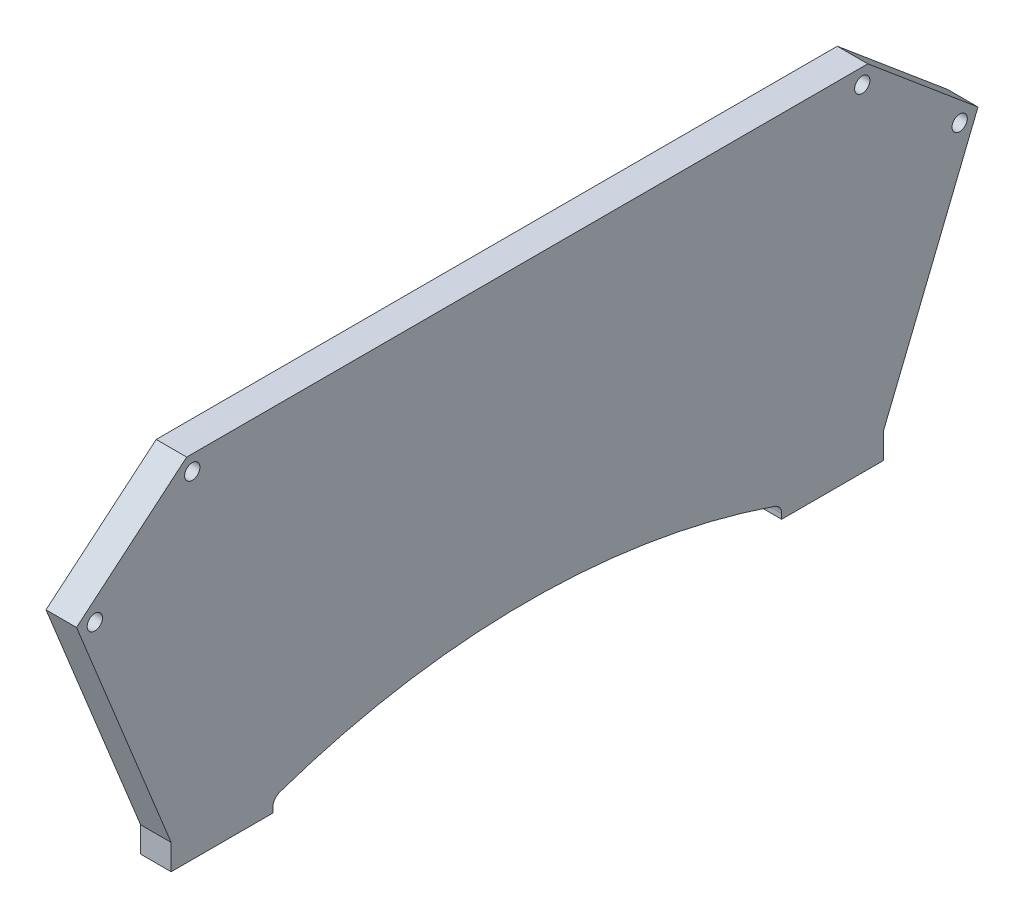
ISO-10303-21;
HEADER;
FILE_DESCRIPTION(('STEP AP214'),'2;1');
FILE_NAME('part.step','',(''),(''),'','','');
FILE_SCHEMA(('AUTOMOTIVE_DESIGN { 1 0 10303 214 1 1 1 1 }'));
ENDSEC;
DATA;
#1=APPLICATION_CONTEXT('core data for automotive mechanical design processes');
#2=APPLICATION_PROTOCOL_DEFINITION('international standard','automotive_design',2000,#1);
#3=PRODUCT_CONTEXT('',#1,'mechanical');
#4=PRODUCT('Part','Part','',(#3));
#5=PRODUCT_RELATED_PRODUCT_CATEGORY('part','',(#4));
#6=PRODUCT_DEFINITION_FORMATION('','',#4);
#7=PRODUCT_DEFINITION_CONTEXT('part definition',#1,'design');
#8=PRODUCT_DEFINITION('design','',#6,#7);
#9=PRODUCT_DEFINITION_SHAPE('','',#8);
#10=(LENGTH_UNIT() NAMED_UNIT(*) SI_UNIT(.MILLI.,.METRE.));
#11=(NAMED_UNIT(*) PLANE_ANGLE_UNIT() SI_UNIT($,.RADIAN.));
#12=(NAMED_UNIT(*) SI_UNIT($,.STERADIAN.) SOLID_ANGLE_UNIT());
#13=UNCERTAINTY_MEASURE_WITH_UNIT(LENGTH_MEASURE(1.E-05),#10,'distance_accuracy_value','');
#14=(GEOMETRIC_REPRESENTATION_CONTEXT(3) GLOBAL_UNCERTAINTY_ASSIGNED_CONTEXT((#13)) GLOBAL_UNIT_ASSIGNED_CONTEXT((#10,
#11,#12)) REPRESENTATION_CONTEXT('',''));
#15=CARTESIAN_POINT('',(0.,0.,0.));
#16=DIRECTION('',(0.,0.,1.));
#17=DIRECTION('',(1.,0.,0.));
#18=AXIS2_PLACEMENT_3D('',#15,#16,#17);
#19=CARTESIAN_POINT('',(6.,1.00000000000001,-22.));
#20=DIRECTION('',(-1.,0.,0.));
#21=DIRECTION('',(0.,0.,1.));
#22=AXIS2_PLACEMENT_3D('',#19,#20,#21);
#23=PLANE('',#22);
#24=CARTESIAN_POINT('',(6.,66.0696902421634,-4.15111107797449));
#25=DIRECTION('',(1.,0.,0.));
#26=DIRECTION('',(0.,0.,-1.));
#27=AXIS2_PLACEMENT_3D('',#24,#25,#26);
#28=CIRCLE('',#27,1.50000000000004);
#29=CARTESIAN_POINT('',(6.,66.0696902421634,-5.65111107797453));
#30=VERTEX_POINT('',#29);
#31=EDGE_CURVE('E349',#30,#30,#28,.T.);
#32=ORIENTED_EDGE('',*,*,#31,.F.);
#33=EDGE_LOOP('',(#32));
#34=FACE_BOUND('',#33,.T.);
#35=CARTESIAN_POINT('',(6.,50.,15.));
#36=DIRECTION('',(1.,0.,0.));
#37=DIRECTION('',(0.,0.,-1.));
#38=AXIS2_PLACEMENT_3D('',#35,#36,#37);
#39=CIRCLE('',#38,1.5);
#40=CARTESIAN_POINT('',(6.,50.,13.5));
#41=VERTEX_POINT('',#40);
#42=EDGE_CURVE('E173',#41,#41,#39,.T.);
#43=ORIENTED_EDGE('',*,*,#42,.F.);
#44=EDGE_LOOP('',(#43));
#45=FACE_BOUND('',#44,.T.);
#46=DIRECTION('',(0.,0.,-1.));
#47=VECTOR('',#46,1.);
#48=CARTESIAN_POINT('',(6.,0.,0.));
#49=LINE('',#48,#47);
#50=CARTESIAN_POINT('',(6.,0.,0.));
#51=VERTEX_POINT('',#50);
#52=CARTESIAN_POINT('',(6.,0.,-20.));
#53=VERTEX_POINT('',#52);
#54=EDGE_CURVE('E196',#51,#53,#49,.T.);
#55=ORIENTED_EDGE('',*,*,#54,.T.);
#56=DIRECTION('',(0.,1.,0.));
#57=VECTOR('',#56,1.);
#58=CARTESIAN_POINT('',(6.,1.,-20.));
#59=LINE('',#58,#57);
#60=CARTESIAN_POINT('',(6.,1.,-20.));
#61=VERTEX_POINT('',#60);
#62=EDGE_CURVE('E112',#53,#61,#59,.T.);
#63=ORIENTED_EDGE('',*,*,#62,.T.);
#64=CARTESIAN_POINT('',(6.,1.00000000000001,-22.));
#65=DIRECTION('',(-1.,0.,0.));
#66=DIRECTION('',(0.,0.,1.));
#67=AXIS2_PLACEMENT_3D('',#64,#65,#66);
#68=CIRCLE('',#67,2.);
#69=CARTESIAN_POINT('',(6.,2.8918918918919,-21.3513513513514));
#70=VERTEX_POINT('',#69);
#71=EDGE_CURVE('E229',#61,#70,#68,.T.);
#72=ORIENTED_EDGE('',*,*,#71,.T.);
#73=CARTESIAN_POINT('',(6.,-139.,-70.));
#74=DIRECTION('',(-1.,0.,0.));
#75=DIRECTION('',(0.,0.,-1.));
#76=AXIS2_PLACEMENT_3D('',#73,#74,#75);
#77=CIRCLE('',#76,150.);
#78=CARTESIAN_POINT('',(6.,2.8918918918919,-118.648648648649));
#79=VERTEX_POINT('',#78);
#80=EDGE_CURVE('E248',#70,#79,#77,.T.);
#81=ORIENTED_EDGE('',*,*,#80,.T.);
#82=CARTESIAN_POINT('',(6.,1.00000000000001,-118.));
#83=DIRECTION('',(-1.,0.,0.));
#84=DIRECTION('',(0.,0.,-1.));
#85=AXIS2_PLACEMENT_3D('',#82,#83,#84);
#86=CIRCLE('',#85,2.00000000000001);
#87=CARTESIAN_POINT('',(6.,1.,-120.));
#88=VERTEX_POINT('',#87);
#89=EDGE_CURVE('E245',#79,#88,#86,.T.);
#90=ORIENTED_EDGE('',*,*,#89,.T.);
#91=DIRECTION('',(0.,-1.,0.));
#92=VECTOR('',#91,1.);
#93=CARTESIAN_POINT('',(6.,1.,-120.));
#94=LINE('',#93,#92);
#95=CARTESIAN_POINT('',(6.,0.,-120.));
#96=VERTEX_POINT('',#95);
#97=EDGE_CURVE('E247',#88,#96,#94,.T.);
#98=ORIENTED_EDGE('',*,*,#97,.T.);
#99=DIRECTION('',(0.,0.,-1.));
#100=VECTOR('',#99,1.);
#101=CARTESIAN_POINT('',(6.,0.,-140.));
#102=LINE('',#101,#100);
#103=CARTESIAN_POINT('',(6.,0.,-140.));
#104=VERTEX_POINT('',#103);
#105=EDGE_CURVE('E250',#96,#104,#102,.T.);
#106=ORIENTED_EDGE('',*,*,#105,.T.);
#107=DIRECTION('',(0.,1.,0.));
#108=VECTOR('',#107,1.);
#109=CARTESIAN_POINT('',(6.,0.,-140.));
#110=LINE('',#109,#108);
#111=CARTESIAN_POINT('',(6.,5.,-140.));
#112=VERTEX_POINT('',#111);
#113=EDGE_CURVE('E256',#104,#112,#110,.T.);
#114=ORIENTED_EDGE('',*,*,#113,.T.);
#115=DIRECTION('',(0.,0.92678403028357,-0.37559467676119));
#116=VECTOR('',#115,1.);
#117=CARTESIAN_POINT('',(6.,50.8955248807109,-158.599926486736));
#118=LINE('',#117,#116);
#119=CARTESIAN_POINT('',(6.,50.8955248807109,-158.599926486736));
#120=VERTEX_POINT('',#119);
#121=EDGE_CURVE('E258',#112,#120,#118,.T.);
#122=ORIENTED_EDGE('',*,*,#121,.T.);
#123=DIRECTION('',(0.,0.642787609686541,0.766044443118977));
#124=VECTOR('',#123,1.);
#125=CARTESIAN_POINT('',(6.,69.0696902421635,-136.940799624824));
#126=LINE('',#125,#124);
#127=CARTESIAN_POINT('',(6.,69.0696902421635,-136.940799624824));
#128=VERTEX_POINT('',#127);
#129=EDGE_CURVE('E260',#120,#128,#126,.T.);
#130=ORIENTED_EDGE('',*,*,#129,.T.);
#131=DIRECTION('',(0.,0.,1.));
#132=VECTOR('',#131,1.);
#133=CARTESIAN_POINT('',(6.,69.0696902421636,-3.05920037517576));
#134=LINE('',#133,#132);
#135=CARTESIAN_POINT('',(6.,69.0696902421636,-3.05920037517576));
#136=VERTEX_POINT('',#135);
#137=EDGE_CURVE('E151',#128,#136,#134,.T.);
#138=ORIENTED_EDGE('',*,*,#137,.T.);
#139=DIRECTION('',(0.,-0.642787609686544,0.766044443118974));
#140=VECTOR('',#139,1.);
#141=CARTESIAN_POINT('',(6.,50.8955248807109,18.5999264867365));
#142=LINE('',#141,#140);
#143=CARTESIAN_POINT('',(6.,50.8955248807109,18.5999264867365));
#144=VERTEX_POINT('',#143);
#145=EDGE_CURVE('E145',#136,#144,#142,.T.);
#146=ORIENTED_EDGE('',*,*,#145,.T.);
#147=DIRECTION('',(0.,-0.92678403028357,-0.37559467676119));
#148=VECTOR('',#147,1.);
#149=CARTESIAN_POINT('',(6.,5.,0.));
#150=LINE('',#149,#148);
#151=CARTESIAN_POINT('',(6.,5.,0.));
#152=VERTEX_POINT('',#151);
#153=EDGE_CURVE('E149',#144,#152,#150,.T.);
#154=ORIENTED_EDGE('',*,*,#153,.T.);
#155=DIRECTION('',(0.,-1.,0.));
#156=VECTOR('',#155,1.);
#157=CARTESIAN_POINT('',(6.,0.,0.));
#158=LINE('',#157,#156);
#159=EDGE_CURVE('E50',#152,#51,#158,.T.);
#160=ORIENTED_EDGE('',*,*,#159,.T.);
#161=EDGE_LOOP('',(#55,#63,#72,#81,#90,#98,#106,#114,#122,#130,#138,#146,#154,#160));
#162=FACE_BOUND('',#161,.T.);
#163=CARTESIAN_POINT('',(6.,50.,-155.));
#164=DIRECTION('',(1.,0.,0.));
#165=DIRECTION('',(0.,0.,-1.));
#166=AXIS2_PLACEMENT_3D('',#163,#164,#165);
#167=CIRCLE('',#166,1.5);
#168=CARTESIAN_POINT('',(6.,50.,-156.5));
#169=VERTEX_POINT('',#168);
#170=EDGE_CURVE('E355',#169,#169,#167,.T.);
#171=ORIENTED_EDGE('',*,*,#170,.F.);
#172=EDGE_LOOP('',(#171));
#173=FACE_BOUND('',#172,.T.);
#174=CARTESIAN_POINT('',(6.,66.0696902421635,-135.848888922026));
#175=DIRECTION('',(1.,0.,0.));
#176=DIRECTION('',(0.,0.,-1.));
#177=AXIS2_PLACEMENT_3D('',#174,#175,#176);
#178=CIRCLE('',#177,1.5);
#179=CARTESIAN_POINT('',(6.,66.0696902421635,-137.348888922026));
#180=VERTEX_POINT('',#179);
#181=EDGE_CURVE('E343',#180,#180,#178,.T.);
#182=ORIENTED_EDGE('',*,*,#181,.F.);
#183=EDGE_LOOP('',(#182));
#184=FACE_BOUND('',#183,.T.);
#185=ADVANCED_FACE('F33',(#34,#45,#162,#173,#184),#23,.F.);
#186=CARTESIAN_POINT('',(0.,1.00000000000001,-22.));
#187=DIRECTION('',(-1.,0.,0.));
#188=DIRECTION('',(0.,0.,1.));
#189=AXIS2_PLACEMENT_3D('',#186,#187,#188);
#190=PLANE('',#189);
#191=CARTESIAN_POINT('',(0.,66.0696902421634,-4.15111107797449));
#192=DIRECTION('',(1.,0.,0.));
#193=DIRECTION('',(0.,0.,-1.));
#194=AXIS2_PLACEMENT_3D('',#191,#192,#193);
#195=CIRCLE('',#194,1.50000000000004);
#196=CARTESIAN_POINT('',(0.,66.0696902421634,-5.65111107797453));
#197=VERTEX_POINT('',#196);
#198=EDGE_CURVE('E346',#197,#197,#195,.T.);
#199=ORIENTED_EDGE('',*,*,#198,.T.);
#200=EDGE_LOOP('',(#199));
#201=FACE_BOUND('',#200,.T.);
#202=CARTESIAN_POINT('',(0.,50.,15.));
#203=DIRECTION('',(1.,0.,0.));
#204=DIRECTION('',(0.,0.,-1.));
#205=AXIS2_PLACEMENT_3D('',#202,#203,#204);
#206=CIRCLE('',#205,1.5);
#207=CARTESIAN_POINT('',(0.,50.,13.5));
#208=VERTEX_POINT('',#207);
#209=EDGE_CURVE('E358',#208,#208,#206,.T.);
#210=ORIENTED_EDGE('',*,*,#209,.T.);
#211=EDGE_LOOP('',(#210));
#212=FACE_BOUND('',#211,.T.);
#213=DIRECTION('',(0.,0.,-1.));
#214=VECTOR('',#213,1.);
#215=CARTESIAN_POINT('',(0.,0.,0.));
#216=LINE('',#215,#214);
#217=CARTESIAN_POINT('',(0.,0.,0.));
#218=VERTEX_POINT('',#217);
#219=CARTESIAN_POINT('',(0.,0.,-20.));
#220=VERTEX_POINT('',#219);
#221=EDGE_CURVE('E169',#218,#220,#216,.T.);
#222=ORIENTED_EDGE('',*,*,#221,.F.);
#223=DIRECTION('',(0.,-1.,0.));
#224=VECTOR('',#223,1.);
#225=CARTESIAN_POINT('',(0.,0.,0.));
#226=LINE('',#225,#224);
#227=CARTESIAN_POINT('',(0.,5.,0.));
#228=VERTEX_POINT('',#227);
#229=EDGE_CURVE('E104',#228,#218,#226,.T.);
#230=ORIENTED_EDGE('',*,*,#229,.F.);
#231=DIRECTION('',(0.,-0.92678403028357,-0.37559467676119));
#232=VECTOR('',#231,1.);
#233=CARTESIAN_POINT('',(0.,5.,0.));
#234=LINE('',#233,#232);
#235=CARTESIAN_POINT('',(0.,50.8955248807109,18.5999264867365));
#236=VERTEX_POINT('',#235);
#237=EDGE_CURVE('E98',#236,#228,#234,.T.);
#238=ORIENTED_EDGE('',*,*,#237,.F.);
#239=DIRECTION('',(0.,-0.642787609686544,0.766044443118974));
#240=VECTOR('',#239,1.);
#241=CARTESIAN_POINT('',(0.,50.8955248807109,18.5999264867365));
#242=LINE('',#241,#240);
#243=CARTESIAN_POINT('',(0.,69.0696902421636,-3.05920037517576));
#244=VERTEX_POINT('',#243);
#245=EDGE_CURVE('E159',#244,#236,#242,.T.);
#246=ORIENTED_EDGE('',*,*,#245,.F.);
#247=DIRECTION('',(0.,0.,1.));
#248=VECTOR('',#247,1.);
#249=CARTESIAN_POINT('',(0.,69.0696902421636,-3.05920037517576));
#250=LINE('',#249,#248);
#251=CARTESIAN_POINT('',(0.,69.0696902421635,-136.940799624824));
#252=VERTEX_POINT('',#251);
#253=EDGE_CURVE('E191',#252,#244,#250,.T.);
#254=ORIENTED_EDGE('',*,*,#253,.F.);
#255=DIRECTION('',(0.,0.642787609686541,0.766044443118977));
#256=VECTOR('',#255,1.);
#257=CARTESIAN_POINT('',(0.,69.0696902421635,-136.940799624824));
#258=LINE('',#257,#256);
#259=CARTESIAN_POINT('',(0.,50.8955248807109,-158.599926486736));
#260=VERTEX_POINT('',#259);
#261=EDGE_CURVE('E189',#260,#252,#258,.T.);
#262=ORIENTED_EDGE('',*,*,#261,.F.);
#263=DIRECTION('',(0.,0.92678403028357,-0.37559467676119));
#264=VECTOR('',#263,1.);
#265=CARTESIAN_POINT('',(0.,50.8955248807109,-158.599926486736));
#266=LINE('',#265,#264);
#267=CARTESIAN_POINT('',(0.,5.,-140.));
#268=VERTEX_POINT('',#267);
#269=EDGE_CURVE('E187',#268,#260,#266,.T.);
#270=ORIENTED_EDGE('',*,*,#269,.F.);
#271=DIRECTION('',(0.,1.,0.));
#272=VECTOR('',#271,1.);
#273=CARTESIAN_POINT('',(0.,0.,-140.));
#274=LINE('',#273,#272);
#275=CARTESIAN_POINT('',(0.,0.,-140.));
#276=VERTEX_POINT('',#275);
#277=EDGE_CURVE('E185',#276,#268,#274,.T.);
#278=ORIENTED_EDGE('',*,*,#277,.F.);
#279=DIRECTION('',(0.,0.,-1.));
#280=VECTOR('',#279,1.);
#281=CARTESIAN_POINT('',(0.,0.,-140.));
#282=LINE('',#281,#280);
#283=CARTESIAN_POINT('',(0.,0.,-120.));
#284=VERTEX_POINT('',#283);
#285=EDGE_CURVE('E183',#284,#276,#282,.T.);
#286=ORIENTED_EDGE('',*,*,#285,.F.);
#287=DIRECTION('',(0.,-1.,0.));
#288=VECTOR('',#287,1.);
#289=CARTESIAN_POINT('',(0.,1.,-120.));
#290=LINE('',#289,#288);
#291=CARTESIAN_POINT('',(0.,1.,-120.));
#292=VERTEX_POINT('',#291);
#293=EDGE_CURVE('E181',#292,#284,#290,.T.);
#294=ORIENTED_EDGE('',*,*,#293,.F.);
#295=CARTESIAN_POINT('',(0.,1.00000000000001,-118.));
#296=DIRECTION('',(-1.,0.,0.));
#297=DIRECTION('',(0.,0.,-1.));
#298=AXIS2_PLACEMENT_3D('',#295,#296,#297);
#299=CIRCLE('',#298,2.00000000000001);
#300=CARTESIAN_POINT('',(0.,2.8918918918919,-118.648648648649));
#301=VERTEX_POINT('',#300);
#302=EDGE_CURVE('E179',#301,#292,#299,.T.);
#303=ORIENTED_EDGE('',*,*,#302,.F.);
#304=CARTESIAN_POINT('',(0.,-139.,-70.));
#305=DIRECTION('',(-1.,0.,0.));
#306=DIRECTION('',(0.,0.,-1.));
#307=AXIS2_PLACEMENT_3D('',#304,#305,#306);
#308=CIRCLE('',#307,150.);
#309=CARTESIAN_POINT('',(0.,2.8918918918919,-21.3513513513514));
#310=VERTEX_POINT('',#309);
#311=EDGE_CURVE('E177',#310,#301,#308,.T.);
#312=ORIENTED_EDGE('',*,*,#311,.F.);
#313=CARTESIAN_POINT('',(0.,1.00000000000001,-22.));
#314=DIRECTION('',(-1.,0.,0.));
#315=DIRECTION('',(0.,0.,1.));
#316=AXIS2_PLACEMENT_3D('',#313,#314,#315);
#317=CIRCLE('',#316,2.);
#318=CARTESIAN_POINT('',(0.,1.,-20.));
#319=VERTEX_POINT('',#318);
#320=EDGE_CURVE('E175',#319,#310,#317,.T.);
#321=ORIENTED_EDGE('',*,*,#320,.F.);
#322=DIRECTION('',(0.,1.,0.));
#323=VECTOR('',#322,1.);
#324=CARTESIAN_POINT('',(0.,1.,-20.));
#325=LINE('',#324,#323);
#326=EDGE_CURVE('E172',#220,#319,#325,.T.);
#327=ORIENTED_EDGE('',*,*,#326,.F.);
#328=EDGE_LOOP('',(#222,#230,#238,#246,#254,#262,#270,#278,#286,#294,#303,#312,#321,#327));
#329=FACE_BOUND('',#328,.T.);
#330=CARTESIAN_POINT('',(0.,50.,-155.));
#331=DIRECTION('',(1.,0.,0.));
#332=DIRECTION('',(0.,0.,-1.));
#333=AXIS2_PLACEMENT_3D('',#330,#331,#332);
#334=CIRCLE('',#333,1.5);
#335=CARTESIAN_POINT('',(0.,50.,-156.5));
#336=VERTEX_POINT('',#335);
#337=EDGE_CURVE('E352',#336,#336,#334,.T.);
#338=ORIENTED_EDGE('',*,*,#337,.T.);
#339=EDGE_LOOP('',(#338));
#340=FACE_BOUND('',#339,.T.);
#341=CARTESIAN_POINT('',(0.,66.0696902421635,-135.848888922026));
#342=DIRECTION('',(1.,0.,0.));
#343=DIRECTION('',(0.,0.,-1.));
#344=AXIS2_PLACEMENT_3D('',#341,#342,#343);
#345=CIRCLE('',#344,1.5);
#346=CARTESIAN_POINT('',(0.,66.0696902421635,-137.348888922026));
#347=VERTEX_POINT('',#346);
#348=EDGE_CURVE('E342',#347,#347,#345,.T.);
#349=ORIENTED_EDGE('',*,*,#348,.T.);
#350=EDGE_LOOP('',(#349));
#351=FACE_BOUND('',#350,.T.);
#352=ADVANCED_FACE('F233',(#201,#212,#329,#340,#351),#190,.T.);
#353=CARTESIAN_POINT('',(6.,0.,0.));
#354=DIRECTION('',(0.,1.,0.));
#355=DIRECTION('',(0.,0.,1.));
#356=AXIS2_PLACEMENT_3D('',#353,#354,#355);
#357=PLANE('',#356);
#358=CARTESIAN_POINT('',(3.,0.,-10.));
#359=DIRECTION('',(0.,-1.,0.));
#360=DIRECTION('',(0.,0.,-1.));
#361=AXIS2_PLACEMENT_3D('',#358,#359,#360);
#362=CIRCLE('',#361,1.25);
#363=CARTESIAN_POINT('',(3.,0.,-11.25));
#364=VERTEX_POINT('',#363);
#365=EDGE_CURVE('E331',#364,#364,#362,.T.);
#366=ORIENTED_EDGE('',*,*,#365,.F.);
#367=EDGE_LOOP('',(#366));
#368=FACE_BOUND('',#367,.T.);
#369=ORIENTED_EDGE('',*,*,#221,.T.);
#370=DIRECTION('',(-1.,0.,0.));
#371=VECTOR('',#370,1.);
#372=CARTESIAN_POINT('',(6.,0.,-20.));
#373=LINE('',#372,#371);
#374=EDGE_CURVE('E11',#53,#220,#373,.T.);
#375=ORIENTED_EDGE('',*,*,#374,.F.);
#376=ORIENTED_EDGE('',*,*,#54,.F.);
#377=DIRECTION('',(-1.,0.,0.));
#378=VECTOR('',#377,1.);
#379=CARTESIAN_POINT('',(6.,0.,0.));
#380=LINE('',#379,#378);
#381=EDGE_CURVE('E165',#51,#218,#380,.T.);
#382=ORIENTED_EDGE('',*,*,#381,.T.);
#383=EDGE_LOOP('',(#369,#375,#376,#382));
#384=FACE_BOUND('',#383,.T.);
#385=ADVANCED_FACE('F35',(#368,#384),#357,.F.);
#386=CARTESIAN_POINT('',(6.,1.,-20.));
#387=DIRECTION('',(0.,0.,1.));
#388=DIRECTION('',(0.,-1.,0.));
#389=AXIS2_PLACEMENT_3D('',#386,#387,#388);
#390=PLANE('',#389);
#391=ORIENTED_EDGE('',*,*,#326,.T.);
#392=DIRECTION('',(-1.,0.,0.));
#393=VECTOR('',#392,1.);
#394=CARTESIAN_POINT('',(6.,1.,-20.));
#395=LINE('',#394,#393);
#396=EDGE_CURVE('E42',#61,#319,#395,.T.);
#397=ORIENTED_EDGE('',*,*,#396,.F.);
#398=ORIENTED_EDGE('',*,*,#62,.F.);
#399=ORIENTED_EDGE('',*,*,#374,.T.);
#400=EDGE_LOOP('',(#391,#397,#398,#399));
#401=FACE_BOUND('',#400,.T.);
#402=ADVANCED_FACE('F420',(#401),#390,.F.);
#403=CARTESIAN_POINT('',(6.,1.00000000000001,-22.));
#404=DIRECTION('',(-1.,0.,0.));
#405=DIRECTION('',(0.,0.,1.));
#406=AXIS2_PLACEMENT_3D('',#403,#404,#405);
#407=CYLINDRICAL_SURFACE('',#406,2.);
#408=ORIENTED_EDGE('',*,*,#320,.T.);
#409=DIRECTION('',(-1.,0.,0.));
#410=VECTOR('',#409,1.);
#411=CARTESIAN_POINT('',(6.,2.8918918918919,-21.3513513513514));
#412=LINE('',#411,#410);
#413=EDGE_CURVE('E221',#70,#310,#412,.T.);
#414=ORIENTED_EDGE('',*,*,#413,.F.);
#415=ORIENTED_EDGE('',*,*,#71,.F.);
#416=ORIENTED_EDGE('',*,*,#396,.T.);
#417=EDGE_LOOP('',(#408,#414,#415,#416));
#418=FACE_BOUND('',#417,.T.);
#419=ADVANCED_FACE('F227',(#418),#407,.F.);
#420=CARTESIAN_POINT('',(6.,-139.,-70.));
#421=DIRECTION('',(-1.,0.,0.));
#422=DIRECTION('',(0.,0.,1.));
#423=AXIS2_PLACEMENT_3D('',#420,#421,#422);
#424=CYLINDRICAL_SURFACE('',#423,150.);
#425=ORIENTED_EDGE('',*,*,#311,.T.);
#426=DIRECTION('',(-1.,0.,0.));
#427=VECTOR('',#426,1.);
#428=CARTESIAN_POINT('',(6.,2.8918918918919,-118.648648648649));
#429=LINE('',#428,#427);
#430=EDGE_CURVE('E218',#79,#301,#429,.T.);
#431=ORIENTED_EDGE('',*,*,#430,.F.);
#432=ORIENTED_EDGE('',*,*,#80,.F.);
#433=ORIENTED_EDGE('',*,*,#413,.T.);
#434=EDGE_LOOP('',(#425,#431,#432,#433));
#435=FACE_BOUND('',#434,.T.);
#436=ADVANCED_FACE('F239',(#435),#424,.F.);
#437=CARTESIAN_POINT('',(6.,1.00000000000001,-118.));
#438=DIRECTION('',(-1.,0.,0.));
#439=DIRECTION('',(0.,0.,1.));
#440=AXIS2_PLACEMENT_3D('',#437,#438,#439);
#441=CYLINDRICAL_SURFACE('',#440,2.00000000000001);
#442=ORIENTED_EDGE('',*,*,#302,.T.);
#443=DIRECTION('',(-1.,0.,0.));
#444=VECTOR('',#443,1.);
#445=CARTESIAN_POINT('',(6.,1.,-120.));
#446=LINE('',#445,#444);
#447=EDGE_CURVE('E215',#88,#292,#446,.T.);
#448=ORIENTED_EDGE('',*,*,#447,.F.);
#449=ORIENTED_EDGE('',*,*,#89,.F.);
#450=ORIENTED_EDGE('',*,*,#430,.T.);
#451=EDGE_LOOP('',(#442,#448,#449,#450));
#452=FACE_BOUND('',#451,.T.);
#453=ADVANCED_FACE('F243',(#452),#441,.F.);
#454=CARTESIAN_POINT('',(6.,1.,-120.));
#455=DIRECTION('',(0.,0.,-1.));
#456=DIRECTION('',(0.,1.,0.));
#457=AXIS2_PLACEMENT_3D('',#454,#455,#456);
#458=PLANE('',#457);
#459=ORIENTED_EDGE('',*,*,#293,.T.);
#460=DIRECTION('',(-1.,0.,0.));
#461=VECTOR('',#460,1.);
#462=CARTESIAN_POINT('',(6.,0.,-120.));
#463=LINE('',#462,#461);
#464=EDGE_CURVE('E212',#96,#284,#463,.T.);
#465=ORIENTED_EDGE('',*,*,#464,.F.);
#466=ORIENTED_EDGE('',*,*,#97,.F.);
#467=ORIENTED_EDGE('',*,*,#447,.T.);
#468=EDGE_LOOP('',(#459,#465,#466,#467));
#469=FACE_BOUND('',#468,.T.);
#470=ADVANCED_FACE('F389',(#469),#458,.F.);
#471=CARTESIAN_POINT('',(6.,0.,-140.));
#472=DIRECTION('',(0.,1.,0.));
#473=DIRECTION('',(0.,0.,1.));
#474=AXIS2_PLACEMENT_3D('',#471,#472,#473);
#475=PLANE('',#474);
#476=CARTESIAN_POINT('',(3.,0.,-130.));
#477=DIRECTION('',(0.,-1.,0.));
#478=DIRECTION('',(0.,0.,-1.));
#479=AXIS2_PLACEMENT_3D('',#476,#477,#478);
#480=CIRCLE('',#479,1.25);
#481=CARTESIAN_POINT('',(3.,0.,-131.25));
#482=VERTEX_POINT('',#481);
#483=EDGE_CURVE('E334',#482,#482,#480,.T.);
#484=ORIENTED_EDGE('',*,*,#483,.F.);
#485=EDGE_LOOP('',(#484));
#486=FACE_BOUND('',#485,.T.);
#487=ORIENTED_EDGE('',*,*,#285,.T.);
#488=DIRECTION('',(-1.,0.,0.));
#489=VECTOR('',#488,1.);
#490=CARTESIAN_POINT('',(6.,0.,-140.));
#491=LINE('',#490,#489);
#492=EDGE_CURVE('E209',#104,#276,#491,.T.);
#493=ORIENTED_EDGE('',*,*,#492,.F.);
#494=ORIENTED_EDGE('',*,*,#105,.F.);
#495=ORIENTED_EDGE('',*,*,#464,.T.);
#496=EDGE_LOOP('',(#487,#493,#494,#495));
#497=FACE_BOUND('',#496,.T.);
#498=ADVANCED_FACE('F385',(#486,#497),#475,.F.);
#499=CARTESIAN_POINT('',(6.,0.,-140.));
#500=DIRECTION('',(0.,0.,1.));
#501=DIRECTION('',(1.,0.,0.));
#502=AXIS2_PLACEMENT_3D('',#499,#500,#501);
#503=PLANE('',#502);
#504=ORIENTED_EDGE('',*,*,#277,.T.);
#505=DIRECTION('',(-1.,0.,0.));
#506=VECTOR('',#505,1.);
#507=CARTESIAN_POINT('',(6.,5.,-140.));
#508=LINE('',#507,#506);
#509=EDGE_CURVE('E206',#112,#268,#508,.T.);
#510=ORIENTED_EDGE('',*,*,#509,.F.);
#511=ORIENTED_EDGE('',*,*,#113,.F.);
#512=ORIENTED_EDGE('',*,*,#492,.T.);
#513=EDGE_LOOP('',(#504,#510,#511,#512));
#514=FACE_BOUND('',#513,.T.);
#515=ADVANCED_FACE('F388',(#514),#503,.F.);
#516=CARTESIAN_POINT('',(6.,50.8955248807109,-158.599926486736));
#517=DIRECTION('',(0.,0.37559467676119,0.92678403028357));
#518=DIRECTION('',(0.,-0.92678403028357,0.37559467676119));
#519=AXIS2_PLACEMENT_3D('',#516,#517,#518);
#520=PLANE('',#519);
#521=ORIENTED_EDGE('',*,*,#269,.T.);
#522=DIRECTION('',(-1.,0.,0.));
#523=VECTOR('',#522,1.);
#524=CARTESIAN_POINT('',(6.,50.8955248807109,-158.599926486736));
#525=LINE('',#524,#523);
#526=EDGE_CURVE('E203',#120,#260,#525,.T.);
#527=ORIENTED_EDGE('',*,*,#526,.F.);
#528=ORIENTED_EDGE('',*,*,#121,.F.);
#529=ORIENTED_EDGE('',*,*,#509,.T.);
#530=EDGE_LOOP('',(#521,#527,#528,#529));
#531=FACE_BOUND('',#530,.T.);
#532=ADVANCED_FACE('F401',(#531),#520,.F.);
#533=CARTESIAN_POINT('',(6.,69.0696902421635,-136.940799624824));
#534=DIRECTION('',(0.,-0.766044443118977,0.642787609686541));
#535=DIRECTION('',(0.,-0.642787609686541,-0.766044443118977));
#536=AXIS2_PLACEMENT_3D('',#533,#534,#535);
#537=PLANE('',#536);
#538=ORIENTED_EDGE('',*,*,#261,.T.);
#539=DIRECTION('',(-1.,0.,0.));
#540=VECTOR('',#539,1.);
#541=CARTESIAN_POINT('',(6.,69.0696902421635,-136.940799624824));
#542=LINE('',#541,#540);
#543=EDGE_CURVE('E200',#128,#252,#542,.T.);
#544=ORIENTED_EDGE('',*,*,#543,.F.);
#545=ORIENTED_EDGE('',*,*,#129,.F.);
#546=ORIENTED_EDGE('',*,*,#526,.T.);
#547=EDGE_LOOP('',(#538,#544,#545,#546));
#548=FACE_BOUND('',#547,.T.);
#549=ADVANCED_FACE('F266',(#548),#537,.F.);
#550=CARTESIAN_POINT('',(6.,69.0696902421636,-3.05920037517576));
#551=DIRECTION('',(0.,-1.,0.));
#552=DIRECTION('',(0.,0.,-1.));
#553=AXIS2_PLACEMENT_3D('',#550,#551,#552);
#554=PLANE('',#553);
#555=ORIENTED_EDGE('',*,*,#253,.T.);
#556=DIRECTION('',(-1.,0.,0.));
#557=VECTOR('',#556,1.);
#558=CARTESIAN_POINT('',(6.,69.0696902421636,-3.05920037517576));
#559=LINE('',#558,#557);
#560=EDGE_CURVE('E160',#136,#244,#559,.T.);
#561=ORIENTED_EDGE('',*,*,#560,.F.);
#562=ORIENTED_EDGE('',*,*,#137,.F.);
#563=ORIENTED_EDGE('',*,*,#543,.T.);
#564=EDGE_LOOP('',(#555,#561,#562,#563));
#565=FACE_BOUND('',#564,.T.);
#566=ADVANCED_FACE('F270',(#565),#554,.F.);
#567=CARTESIAN_POINT('',(6.,50.8955248807109,18.5999264867365));
#568=DIRECTION('',(0.,-0.766044443118974,-0.642787609686544));
#569=DIRECTION('',(0.,0.642787609686544,-0.766044443118974));
#570=AXIS2_PLACEMENT_3D('',#567,#568,#569);
#571=PLANE('',#570);
#572=ORIENTED_EDGE('',*,*,#245,.T.);
#573=DIRECTION('',(-1.,0.,0.));
#574=VECTOR('',#573,1.);
#575=CARTESIAN_POINT('',(6.,50.8955248807109,18.5999264867365));
#576=LINE('',#575,#574);
#577=EDGE_CURVE('E156',#144,#236,#576,.T.);
#578=ORIENTED_EDGE('',*,*,#577,.F.);
#579=ORIENTED_EDGE('',*,*,#145,.F.);
#580=ORIENTED_EDGE('',*,*,#560,.T.);
#581=EDGE_LOOP('',(#572,#578,#579,#580));
#582=FACE_BOUND('',#581,.T.);
#583=ADVANCED_FACE('F157',(#582),#571,.F.);
#584=CARTESIAN_POINT('',(6.,5.,0.));
#585=DIRECTION('',(0.,0.37559467676119,-0.92678403028357));
#586=DIRECTION('',(0.,0.92678403028357,0.37559467676119));
#587=AXIS2_PLACEMENT_3D('',#584,#585,#586);
#588=PLANE('',#587);
#589=ORIENTED_EDGE('',*,*,#237,.T.);
#590=DIRECTION('',(-1.,0.,0.));
#591=VECTOR('',#590,1.);
#592=CARTESIAN_POINT('',(6.,5.,0.));
#593=LINE('',#592,#591);
#594=EDGE_CURVE('E161',#152,#228,#593,.T.);
#595=ORIENTED_EDGE('',*,*,#594,.F.);
#596=ORIENTED_EDGE('',*,*,#153,.F.);
#597=ORIENTED_EDGE('',*,*,#577,.T.);
#598=EDGE_LOOP('',(#589,#595,#596,#597));
#599=FACE_BOUND('',#598,.T.);
#600=ADVANCED_FACE('F163',(#599),#588,.F.);
#601=CARTESIAN_POINT('',(6.,0.,0.));
#602=DIRECTION('',(0.,0.,-1.));
#603=DIRECTION('',(-1.,0.,0.));
#604=AXIS2_PLACEMENT_3D('',#601,#602,#603);
#605=PLANE('',#604);
#606=ORIENTED_EDGE('',*,*,#229,.T.);
#607=ORIENTED_EDGE('',*,*,#381,.F.);
#608=ORIENTED_EDGE('',*,*,#159,.F.);
#609=ORIENTED_EDGE('',*,*,#594,.T.);
#610=EDGE_LOOP('',(#606,#607,#608,#609));
#611=FACE_BOUND('',#610,.T.);
#612=ADVANCED_FACE('F274',(#611),#605,.F.);
#613=CARTESIAN_POINT('',(6.,50.,15.));
#614=DIRECTION('',(-1.,0.,0.));
#615=DIRECTION('',(0.,0.,1.));
#616=AXIS2_PLACEMENT_3D('',#613,#614,#615);
#617=CYLINDRICAL_SURFACE('',#616,1.5);
#618=ORIENTED_EDGE('',*,*,#42,.T.);
#619=EDGE_LOOP('',(#618));
#620=FACE_BOUND('',#619,.T.);
#621=ORIENTED_EDGE('',*,*,#209,.F.);
#622=EDGE_LOOP('',(#621));
#623=FACE_BOUND('',#622,.T.);
#624=ADVANCED_FACE('F276',(#620,#623),#617,.F.);
#625=CARTESIAN_POINT('',(6.,50.,-155.));
#626=DIRECTION('',(-1.,0.,0.));
#627=DIRECTION('',(0.,0.,1.));
#628=AXIS2_PLACEMENT_3D('',#625,#626,#627);
#629=CYLINDRICAL_SURFACE('',#628,1.5);
#630=ORIENTED_EDGE('',*,*,#170,.T.);
#631=EDGE_LOOP('',(#630));
#632=FACE_BOUND('',#631,.T.);
#633=ORIENTED_EDGE('',*,*,#337,.F.);
#634=EDGE_LOOP('',(#633));
#635=FACE_BOUND('',#634,.T.);
#636=ADVANCED_FACE('F282',(#632,#635),#629,.F.);
#637=CARTESIAN_POINT('',(6.,66.0696902421634,-4.15111107797449));
#638=DIRECTION('',(-1.,0.,0.));
#639=DIRECTION('',(0.,0.,1.));
#640=AXIS2_PLACEMENT_3D('',#637,#638,#639);
#641=CYLINDRICAL_SURFACE('',#640,1.50000000000004);
#642=ORIENTED_EDGE('',*,*,#31,.T.);
#643=EDGE_LOOP('',(#642));
#644=FACE_BOUND('',#643,.T.);
#645=ORIENTED_EDGE('',*,*,#198,.F.);
#646=EDGE_LOOP('',(#645));
#647=FACE_BOUND('',#646,.T.);
#648=ADVANCED_FACE('F299',(#644,#647),#641,.F.);
#649=CARTESIAN_POINT('',(6.,66.0696902421635,-135.848888922026));
#650=DIRECTION('',(-1.,0.,0.));
#651=DIRECTION('',(0.,0.,1.));
#652=AXIS2_PLACEMENT_3D('',#649,#650,#651);
#653=CYLINDRICAL_SURFACE('',#652,1.5);
#654=ORIENTED_EDGE('',*,*,#181,.T.);
#655=EDGE_LOOP('',(#654));
#656=FACE_BOUND('',#655,.T.);
#657=ORIENTED_EDGE('',*,*,#348,.F.);
#658=EDGE_LOOP('',(#657));
#659=FACE_BOUND('',#658,.T.);
#660=ADVANCED_FACE('F303',(#656,#659),#653,.F.);
#661=CARTESIAN_POINT('',(3.,10.,-130.));
#662=DIRECTION('',(0.,-1.,0.));
#663=DIRECTION('',(0.,0.,-1.));
#664=AXIS2_PLACEMENT_3D('',#661,#662,#663);
#665=CONICAL_SURFACE('',#664,1.25,1.02974425867665);
#666=CARTESIAN_POINT('',(3.,10.7510757737845,-130.));
#667=VERTEX_POINT('',#666);
#668=VERTEX_LOOP('',#667);
#669=FACE_BOUND('',#668,.T.);
#670=CARTESIAN_POINT('',(3.,10.,-130.));
#671=DIRECTION('',(0.,-1.,0.));
#672=DIRECTION('',(0.,0.,-1.));
#673=AXIS2_PLACEMENT_3D('',#670,#671,#672);
#674=CIRCLE('',#673,1.25);
#675=CARTESIAN_POINT('',(3.,10.,-131.25));
#676=VERTEX_POINT('',#675);
#677=EDGE_CURVE('E339',#676,#676,#674,.T.);
#678=ORIENTED_EDGE('',*,*,#677,.T.);
#679=EDGE_LOOP('',(#678));
#680=FACE_BOUND('',#679,.T.);
#681=ADVANCED_FACE('F307',(#669,#680),#665,.F.);
#682=CARTESIAN_POINT('',(3.,0.,-130.));
#683=DIRECTION('',(0.,-1.,0.));
#684=DIRECTION('',(0.,0.,-1.));
#685=AXIS2_PLACEMENT_3D('',#682,#683,#684);
#686=CYLINDRICAL_SURFACE('',#685,1.25);
#687=ORIENTED_EDGE('',*,*,#677,.F.);
#688=EDGE_LOOP('',(#687));
#689=FACE_BOUND('',#688,.T.);
#690=ORIENTED_EDGE('',*,*,#483,.T.);
#691=EDGE_LOOP('',(#690));
#692=FACE_BOUND('',#691,.T.);
#693=ADVANCED_FACE('F311',(#689,#692),#686,.F.);
#694=CARTESIAN_POINT('',(3.,10.,-10.));
#695=DIRECTION('',(0.,-1.,0.));
#696=DIRECTION('',(0.,0.,-1.));
#697=AXIS2_PLACEMENT_3D('',#694,#695,#696);
#698=CONICAL_SURFACE('',#697,1.25,1.02974425867665);
#699=CARTESIAN_POINT('',(3.,10.7510757737845,-10.));
#700=VERTEX_POINT('',#699);
#701=VERTEX_LOOP('',#700);
#702=FACE_BOUND('',#701,.T.);
#703=CARTESIAN_POINT('',(3.,10.,-10.));
#704=DIRECTION('',(0.,-1.,0.));
#705=DIRECTION('',(0.,0.,-1.));
#706=AXIS2_PLACEMENT_3D('',#703,#704,#705);
#707=CIRCLE('',#706,1.25);
#708=CARTESIAN_POINT('',(3.,10.,-11.25));
#709=VERTEX_POINT('',#708);
#710=EDGE_CURVE('E328',#709,#709,#707,.T.);
#711=ORIENTED_EDGE('',*,*,#710,.T.);
#712=EDGE_LOOP('',(#711));
#713=FACE_BOUND('',#712,.T.);
#714=ADVANCED_FACE('F315',(#702,#713),#698,.F.);
#715=CARTESIAN_POINT('',(3.,0.,-10.));
#716=DIRECTION('',(0.,-1.,0.));
#717=DIRECTION('',(0.,0.,-1.));
#718=AXIS2_PLACEMENT_3D('',#715,#716,#717);
#719=CYLINDRICAL_SURFACE('',#718,1.25);
#720=ORIENTED_EDGE('',*,*,#710,.F.);
#721=EDGE_LOOP('',(#720));
#722=FACE_BOUND('',#721,.T.);
#723=ORIENTED_EDGE('',*,*,#365,.T.);
#724=EDGE_LOOP('',(#723));
#725=FACE_BOUND('',#724,.T.);
#726=ADVANCED_FACE('F319',(#722,#725),#719,.F.);
#727=CLOSED_SHELL('',(#185,#352,#385,#402,#419,#436,#453,#470,#498,#515,#532,#549,#566,#583,
#600,#612,#624,#636,#648,#660,#681,#693,#714,#726));
#728=MANIFOLD_SOLID_BREP('B2',#727);
#729=ADVANCED_BREP_SHAPE_REPRESENTATION('',(#18,#728),#14);
#730=SHAPE_DEFINITION_REPRESENTATION(#9,#729);
ENDSEC;
END-ISO-10303-21;
